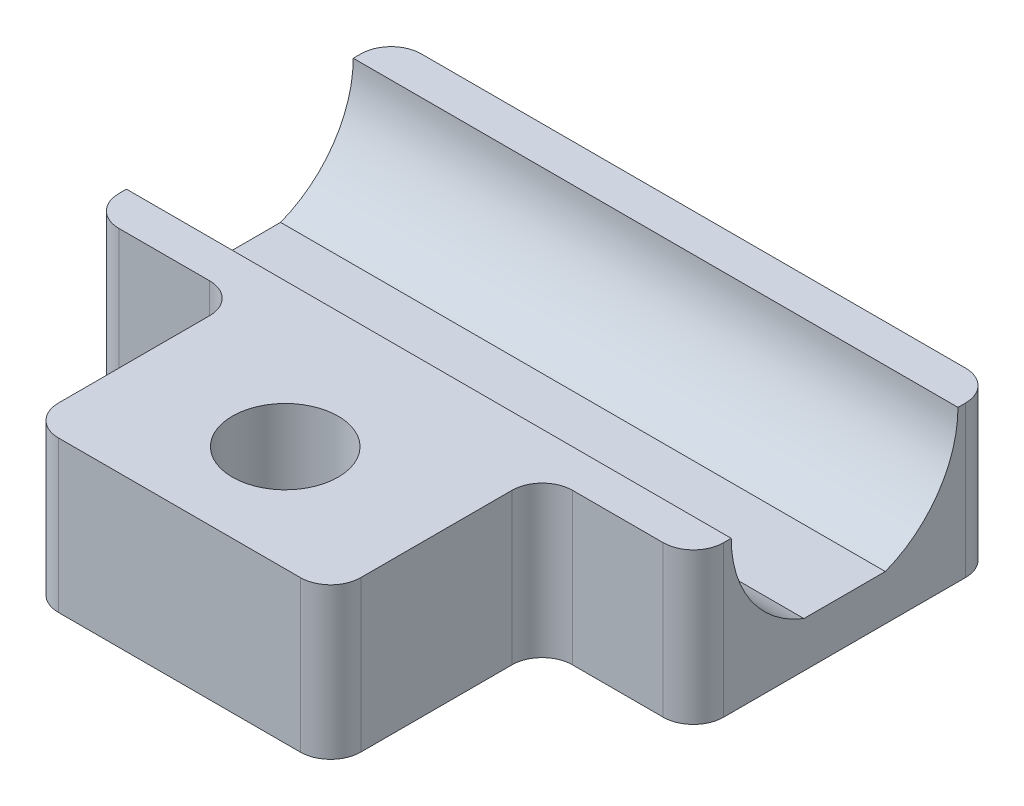
ISO-10303-21;
HEADER;
FILE_DESCRIPTION(('STEP AP214'),'2;1');
FILE_NAME('part.step','',(''),(''),'','','');
FILE_SCHEMA(('AUTOMOTIVE_DESIGN { 1 0 10303 214 1 1 1 1 }'));
ENDSEC;
DATA;
#1=APPLICATION_CONTEXT('core data for automotive mechanical design processes');
#2=APPLICATION_PROTOCOL_DEFINITION('international standard','automotive_design',2000,#1);
#3=PRODUCT_CONTEXT('',#1,'mechanical');
#4=PRODUCT('Part','Part','',(#3));
#5=PRODUCT_RELATED_PRODUCT_CATEGORY('part','',(#4));
#6=PRODUCT_DEFINITION_FORMATION('','',#4);
#7=PRODUCT_DEFINITION_CONTEXT('part definition',#1,'design');
#8=PRODUCT_DEFINITION('design','',#6,#7);
#9=PRODUCT_DEFINITION_SHAPE('','',#8);
#10=(LENGTH_UNIT() NAMED_UNIT(*) SI_UNIT(.MILLI.,.METRE.));
#11=(NAMED_UNIT(*) PLANE_ANGLE_UNIT() SI_UNIT($,.RADIAN.));
#12=(NAMED_UNIT(*) SI_UNIT($,.STERADIAN.) SOLID_ANGLE_UNIT());
#13=UNCERTAINTY_MEASURE_WITH_UNIT(LENGTH_MEASURE(1.E-05),#10,'distance_accuracy_value','');
#14=(GEOMETRIC_REPRESENTATION_CONTEXT(3) GLOBAL_UNCERTAINTY_ASSIGNED_CONTEXT((#13)) GLOBAL_UNIT_ASSIGNED_CONTEXT((#10,
#11,#12)) REPRESENTATION_CONTEXT('',''));
#15=CARTESIAN_POINT('',(0.,0.,0.));
#16=DIRECTION('',(0.,0.,1.));
#17=DIRECTION('',(1.,0.,0.));
#18=AXIS2_PLACEMENT_3D('',#15,#16,#17);
#19=CARTESIAN_POINT('',(0.,10.,0.));
#20=DIRECTION('',(0.,1.,0.));
#21=DIRECTION('',(0.,0.,1.));
#22=AXIS2_PLACEMENT_3D('',#19,#20,#21);
#23=PLANE('',#22);
#24=DIRECTION('',(0.,0.,1.));
#25=VECTOR('',#24,1.);
#26=CARTESIAN_POINT('',(-10.,10.,9.99999999999999));
#27=LINE('',#26,#25);
#28=CARTESIAN_POINT('',(-10.,10.,12.));
#29=VERTEX_POINT('',#28);
#30=CARTESIAN_POINT('',(-10.,10.,22.));
#31=VERTEX_POINT('',#30);
#32=EDGE_CURVE('E217',#29,#31,#27,.T.);
#33=ORIENTED_EDGE('',*,*,#32,.T.);
#34=CARTESIAN_POINT('',(-8.00000000000001,10.,22.));
#35=DIRECTION('',(0.,1.,0.));
#36=DIRECTION('',(0.,0.,1.));
#37=AXIS2_PLACEMENT_3D('',#34,#35,#36);
#38=CIRCLE('',#37,2.);
#39=CARTESIAN_POINT('',(-8.00000000000001,10.,24.));
#40=VERTEX_POINT('',#39);
#41=EDGE_CURVE('E287',#31,#40,#38,.T.);
#42=ORIENTED_EDGE('',*,*,#41,.T.);
#43=DIRECTION('',(1.,0.,0.));
#44=VECTOR('',#43,1.);
#45=CARTESIAN_POINT('',(-10.,10.,24.));
#46=LINE('',#45,#44);
#47=CARTESIAN_POINT('',(8.,10.,24.));
#48=VERTEX_POINT('',#47);
#49=EDGE_CURVE('E220',#40,#48,#46,.T.);
#50=ORIENTED_EDGE('',*,*,#49,.T.);
#51=CARTESIAN_POINT('',(7.99999999999999,10.,22.));
#52=DIRECTION('',(0.,1.,0.));
#53=DIRECTION('',(0.,0.,1.));
#54=AXIS2_PLACEMENT_3D('',#51,#52,#53);
#55=CIRCLE('',#54,2.);
#56=CARTESIAN_POINT('',(9.99999999999999,10.,22.));
#57=VERTEX_POINT('',#56);
#58=EDGE_CURVE('E281',#48,#57,#55,.T.);
#59=ORIENTED_EDGE('',*,*,#58,.T.);
#60=DIRECTION('',(0.,0.,-1.));
#61=VECTOR('',#60,1.);
#62=CARTESIAN_POINT('',(9.99999999999999,10.,9.99999999999999));
#63=LINE('',#62,#61);
#64=CARTESIAN_POINT('',(9.99999999999999,10.,12.));
#65=VERTEX_POINT('',#64);
#66=EDGE_CURVE('E223',#57,#65,#63,.T.);
#67=ORIENTED_EDGE('',*,*,#66,.T.);
#68=CARTESIAN_POINT('',(12.,10.,12.));
#69=DIRECTION('',(0.,1.,0.));
#70=DIRECTION('',(0.,0.,1.));
#71=AXIS2_PLACEMENT_3D('',#68,#69,#70);
#72=CIRCLE('',#71,2.);
#73=CARTESIAN_POINT('',(12.,10.,9.99999999999999));
#74=VERTEX_POINT('',#73);
#75=EDGE_CURVE('E11',#65,#74,#72,.F.);
#76=ORIENTED_EDGE('',*,*,#75,.T.);
#77=DIRECTION('',(1.,0.,0.));
#78=VECTOR('',#77,1.);
#79=CARTESIAN_POINT('',(20.,10.,10.));
#80=LINE('',#79,#78);
#81=CARTESIAN_POINT('',(18.,10.,10.));
#82=VERTEX_POINT('',#81);
#83=EDGE_CURVE('E226',#74,#82,#80,.T.);
#84=ORIENTED_EDGE('',*,*,#83,.T.);
#85=CARTESIAN_POINT('',(18.,10.,8.));
#86=DIRECTION('',(0.,1.,0.));
#87=DIRECTION('',(0.,0.,1.));
#88=AXIS2_PLACEMENT_3D('',#85,#86,#87);
#89=CIRCLE('',#88,2.);
#90=CARTESIAN_POINT('',(20.,10.,8.));
#91=VERTEX_POINT('',#90);
#92=EDGE_CURVE('E283',#82,#91,#89,.T.);
#93=ORIENTED_EDGE('',*,*,#92,.T.);
#94=DIRECTION('',(0.,0.,-1.));
#95=VECTOR('',#94,1.);
#96=CARTESIAN_POINT('',(20.,10.,10.));
#97=LINE('',#96,#95);
#98=CARTESIAN_POINT('',(20.,10.,7.5));
#99=VERTEX_POINT('',#98);
#100=EDGE_CURVE('E230',#91,#99,#97,.T.);
#101=ORIENTED_EDGE('',*,*,#100,.T.);
#102=DIRECTION('',(1.,0.,0.));
#103=VECTOR('',#102,1.);
#104=CARTESIAN_POINT('',(-20.,10.,7.49999999999999));
#105=LINE('',#104,#103);
#106=CARTESIAN_POINT('',(-20.,10.,7.49999999999999));
#107=VERTEX_POINT('',#106);
#108=EDGE_CURVE('E257',#107,#99,#105,.T.);
#109=ORIENTED_EDGE('',*,*,#108,.F.);
#110=DIRECTION('',(0.,0.,1.));
#111=VECTOR('',#110,1.);
#112=CARTESIAN_POINT('',(-20.,10.,10.));
#113=LINE('',#112,#111);
#114=CARTESIAN_POINT('',(-20.,10.,8.));
#115=VERTEX_POINT('',#114);
#116=EDGE_CURVE('E197',#107,#115,#113,.T.);
#117=ORIENTED_EDGE('',*,*,#116,.T.);
#118=CARTESIAN_POINT('',(-18.,10.,8.));
#119=DIRECTION('',(0.,1.,0.));
#120=DIRECTION('',(0.,0.,1.));
#121=AXIS2_PLACEMENT_3D('',#118,#119,#120);
#122=CIRCLE('',#121,2.);
#123=CARTESIAN_POINT('',(-18.,10.,10.));
#124=VERTEX_POINT('',#123);
#125=EDGE_CURVE('E285',#115,#124,#122,.T.);
#126=ORIENTED_EDGE('',*,*,#125,.T.);
#127=DIRECTION('',(1.,0.,0.));
#128=VECTOR('',#127,1.);
#129=CARTESIAN_POINT('',(-10.,10.,9.99999999999999));
#130=LINE('',#129,#128);
#131=CARTESIAN_POINT('',(-12.,10.,10.));
#132=VERTEX_POINT('',#131);
#133=EDGE_CURVE('E214',#124,#132,#130,.T.);
#134=ORIENTED_EDGE('',*,*,#133,.T.);
#135=CARTESIAN_POINT('',(-12.,10.,12.));
#136=DIRECTION('',(0.,1.,0.));
#137=DIRECTION('',(0.,0.,1.));
#138=AXIS2_PLACEMENT_3D('',#135,#136,#137);
#139=CIRCLE('',#138,2.);
#140=EDGE_CURVE('E323',#132,#29,#139,.F.);
#141=ORIENTED_EDGE('',*,*,#140,.T.);
#142=EDGE_LOOP('',(#33,#42,#50,#59,#67,#76,#84,#93,#101,#109,#117,#126,#134,#141));
#143=FACE_BOUND('',#142,.T.);
#144=CARTESIAN_POINT('',(0.,10.,17.));
#145=DIRECTION('',(0.,1.,0.));
#146=DIRECTION('',(0.,0.,1.));
#147=AXIS2_PLACEMENT_3D('',#144,#145,#146);
#148=CIRCLE('',#147,3.5);
#149=CARTESIAN_POINT('',(0.,10.,20.5));
#150=VERTEX_POINT('',#149);
#151=EDGE_CURVE('E204',#150,#150,#148,.T.);
#152=ORIENTED_EDGE('',*,*,#151,.F.);
#153=EDGE_LOOP('',(#152));
#154=FACE_BOUND('',#153,.T.);
#155=ADVANCED_FACE('F32',(#143,#154),#23,.T.);
#156=CARTESIAN_POINT('',(-20.,10.,10.));
#157=DIRECTION('',(1.,0.,0.));
#158=DIRECTION('',(0.,0.,-1.));
#159=AXIS2_PLACEMENT_3D('',#156,#157,#158);
#160=PLANE('',#159);
#161=DIRECTION('',(0.,0.,1.));
#162=VECTOR('',#161,1.);
#163=CARTESIAN_POINT('',(-20.,0.,10.));
#164=LINE('',#163,#162);
#165=CARTESIAN_POINT('',(-20.,0.,-7.99999999999999));
#166=VERTEX_POINT('',#165);
#167=CARTESIAN_POINT('',(-20.,0.,8.));
#168=VERTEX_POINT('',#167);
#169=EDGE_CURVE('E209',#166,#168,#164,.T.);
#170=ORIENTED_EDGE('',*,*,#169,.T.);
#171=DIRECTION('',(0.,-1.,0.));
#172=VECTOR('',#171,1.);
#173=CARTESIAN_POINT('',(-20.,10.,8.));
#174=LINE('',#173,#172);
#175=EDGE_CURVE('E297',#168,#115,#174,.F.);
#176=ORIENTED_EDGE('',*,*,#175,.T.);
#177=ORIENTED_EDGE('',*,*,#116,.F.);
#178=CARTESIAN_POINT('',(-20.,10.,0.));
#179=DIRECTION('',(1.,0.,0.));
#180=DIRECTION('',(0.,0.,-1.));
#181=AXIS2_PLACEMENT_3D('',#178,#179,#180);
#182=CIRCLE('',#181,7.5);
#183=CARTESIAN_POINT('',(-20.,3.,2.69258240356725));
#184=VERTEX_POINT('',#183);
#185=EDGE_CURVE('E176',#107,#184,#182,.T.);
#186=ORIENTED_EDGE('',*,*,#185,.T.);
#187=DIRECTION('',(0.,0.,-1.));
#188=VECTOR('',#187,1.);
#189=CARTESIAN_POINT('',(-20.,3.,2.69258240356725));
#190=LINE('',#189,#188);
#191=CARTESIAN_POINT('',(-20.,3.,-2.69258240356725));
#192=VERTEX_POINT('',#191);
#193=EDGE_CURVE('E184',#184,#192,#190,.T.);
#194=ORIENTED_EDGE('',*,*,#193,.T.);
#195=CARTESIAN_POINT('',(-20.,10.,-7.50000000000001));
#196=VERTEX_POINT('',#195);
#197=EDGE_CURVE('E191',#192,#196,#182,.T.);
#198=ORIENTED_EDGE('',*,*,#197,.T.);
#199=CARTESIAN_POINT('',(-20.,10.,-7.99999999999999));
#200=VERTEX_POINT('',#199);
#201=EDGE_CURVE('E212',#200,#196,#113,.T.);
#202=ORIENTED_EDGE('',*,*,#201,.F.);
#203=DIRECTION('',(0.,-1.,0.));
#204=VECTOR('',#203,1.);
#205=CARTESIAN_POINT('',(-20.,10.,-7.99999999999999));
#206=LINE('',#205,#204);
#207=EDGE_CURVE('E294',#200,#166,#206,.T.);
#208=ORIENTED_EDGE('',*,*,#207,.T.);
#209=EDGE_LOOP('',(#170,#176,#177,#186,#194,#198,#202,#208));
#210=FACE_BOUND('',#209,.T.);
#211=ADVANCED_FACE('F195',(#210),#160,.F.);
#212=CARTESIAN_POINT('',(-10.,10.,9.99999999999999));
#213=DIRECTION('',(0.,0.,-1.));
#214=DIRECTION('',(-1.,0.,0.));
#215=AXIS2_PLACEMENT_3D('',#212,#213,#214);
#216=PLANE('',#215);
#217=DIRECTION('',(1.,0.,0.));
#218=VECTOR('',#217,1.);
#219=CARTESIAN_POINT('',(-10.,0.,9.99999999999999));
#220=LINE('',#219,#218);
#221=CARTESIAN_POINT('',(-18.,0.,10.));
#222=VERTEX_POINT('',#221);
#223=CARTESIAN_POINT('',(-12.,0.,10.));
#224=VERTEX_POINT('',#223);
#225=EDGE_CURVE('E236',#222,#224,#220,.T.);
#226=ORIENTED_EDGE('',*,*,#225,.T.);
#227=DIRECTION('',(0.,-1.,0.));
#228=VECTOR('',#227,1.);
#229=CARTESIAN_POINT('',(-12.,10.,9.99999999999999));
#230=LINE('',#229,#228);
#231=EDGE_CURVE('E292',#224,#132,#230,.F.);
#232=ORIENTED_EDGE('',*,*,#231,.T.);
#233=ORIENTED_EDGE('',*,*,#133,.F.);
#234=DIRECTION('',(0.,-1.,0.));
#235=VECTOR('',#234,1.);
#236=CARTESIAN_POINT('',(-18.,10.,10.));
#237=LINE('',#236,#235);
#238=EDGE_CURVE('E289',#124,#222,#237,.T.);
#239=ORIENTED_EDGE('',*,*,#238,.T.);
#240=EDGE_LOOP('',(#226,#232,#233,#239));
#241=FACE_BOUND('',#240,.T.);
#242=ADVANCED_FACE('F383',(#241),#216,.F.);
#243=CARTESIAN_POINT('',(-10.,10.,9.99999999999999));
#244=DIRECTION('',(1.,0.,0.));
#245=DIRECTION('',(0.,0.,-1.));
#246=AXIS2_PLACEMENT_3D('',#243,#244,#245);
#247=PLANE('',#246);
#248=DIRECTION('',(0.,0.,1.));
#249=VECTOR('',#248,1.);
#250=CARTESIAN_POINT('',(-10.,0.,9.99999999999999));
#251=LINE('',#250,#249);
#252=CARTESIAN_POINT('',(-10.,0.,12.));
#253=VERTEX_POINT('',#252);
#254=CARTESIAN_POINT('',(-10.,0.,22.));
#255=VERTEX_POINT('',#254);
#256=EDGE_CURVE('E239',#253,#255,#251,.T.);
#257=ORIENTED_EDGE('',*,*,#256,.T.);
#258=DIRECTION('',(0.,-1.,0.));
#259=VECTOR('',#258,1.);
#260=CARTESIAN_POINT('',(-10.,10.,22.));
#261=LINE('',#260,#259);
#262=EDGE_CURVE('E279',#255,#31,#261,.F.);
#263=ORIENTED_EDGE('',*,*,#262,.T.);
#264=ORIENTED_EDGE('',*,*,#32,.F.);
#265=DIRECTION('',(0.,-1.,0.));
#266=VECTOR('',#265,1.);
#267=CARTESIAN_POINT('',(-10.,0.,12.));
#268=LINE('',#267,#266);
#269=EDGE_CURVE('E276',#29,#253,#268,.T.);
#270=ORIENTED_EDGE('',*,*,#269,.T.);
#271=EDGE_LOOP('',(#257,#263,#264,#270));
#272=FACE_BOUND('',#271,.T.);
#273=ADVANCED_FACE('F407',(#272),#247,.F.);
#274=CARTESIAN_POINT('',(-10.,10.,24.));
#275=DIRECTION('',(0.,0.,-1.));
#276=DIRECTION('',(-1.,0.,0.));
#277=AXIS2_PLACEMENT_3D('',#274,#275,#276);
#278=PLANE('',#277);
#279=ORIENTED_EDGE('',*,*,#49,.F.);
#280=DIRECTION('',(0.,-1.,0.));
#281=VECTOR('',#280,1.);
#282=CARTESIAN_POINT('',(-8.00000000000001,10.,24.));
#283=LINE('',#282,#281);
#284=CARTESIAN_POINT('',(-8.00000000000001,0.,24.));
#285=VERTEX_POINT('',#284);
#286=EDGE_CURVE('E261',#40,#285,#283,.T.);
#287=ORIENTED_EDGE('',*,*,#286,.T.);
#288=DIRECTION('',(1.,0.,0.));
#289=VECTOR('',#288,1.);
#290=CARTESIAN_POINT('',(-10.,0.,24.));
#291=LINE('',#290,#289);
#292=CARTESIAN_POINT('',(8.,0.,24.));
#293=VERTEX_POINT('',#292);
#294=EDGE_CURVE('E242',#285,#293,#291,.T.);
#295=ORIENTED_EDGE('',*,*,#294,.T.);
#296=DIRECTION('',(0.,-1.,0.));
#297=VECTOR('',#296,1.);
#298=CARTESIAN_POINT('',(8.,10.,24.));
#299=LINE('',#298,#297);
#300=EDGE_CURVE('E259',#293,#48,#299,.F.);
#301=ORIENTED_EDGE('',*,*,#300,.T.);
#302=EDGE_LOOP('',(#279,#287,#295,#301));
#303=FACE_BOUND('',#302,.T.);
#304=ADVANCED_FACE('F404',(#303),#278,.F.);
#305=CARTESIAN_POINT('',(9.99999999999999,10.,9.99999999999999));
#306=DIRECTION('',(-1.,0.,0.));
#307=DIRECTION('',(0.,0.,1.));
#308=AXIS2_PLACEMENT_3D('',#305,#306,#307);
#309=PLANE('',#308);
#310=DIRECTION('',(0.,0.,-1.));
#311=VECTOR('',#310,1.);
#312=CARTESIAN_POINT('',(9.99999999999999,0.,9.99999999999999));
#313=LINE('',#312,#311);
#314=CARTESIAN_POINT('',(9.99999999999999,0.,22.));
#315=VERTEX_POINT('',#314);
#316=CARTESIAN_POINT('',(9.99999999999999,0.,12.));
#317=VERTEX_POINT('',#316);
#318=EDGE_CURVE('E245',#315,#317,#313,.T.);
#319=ORIENTED_EDGE('',*,*,#318,.T.);
#320=DIRECTION('',(0.,-1.,0.));
#321=VECTOR('',#320,1.);
#322=CARTESIAN_POINT('',(9.99999999999999,10.,12.));
#323=LINE('',#322,#321);
#324=EDGE_CURVE('E319',#317,#65,#323,.F.);
#325=ORIENTED_EDGE('',*,*,#324,.T.);
#326=ORIENTED_EDGE('',*,*,#66,.F.);
#327=DIRECTION('',(0.,-1.,0.));
#328=VECTOR('',#327,1.);
#329=CARTESIAN_POINT('',(9.99999999999999,10.,22.));
#330=LINE('',#329,#328);
#331=EDGE_CURVE('E316',#57,#315,#330,.T.);
#332=ORIENTED_EDGE('',*,*,#331,.T.);
#333=EDGE_LOOP('',(#319,#325,#326,#332));
#334=FACE_BOUND('',#333,.T.);
#335=ADVANCED_FACE('F333',(#334),#309,.F.);
#336=CARTESIAN_POINT('',(20.,10.,10.));
#337=DIRECTION('',(0.,0.,-1.));
#338=DIRECTION('',(-1.,0.,0.));
#339=AXIS2_PLACEMENT_3D('',#336,#337,#338);
#340=PLANE('',#339);
#341=DIRECTION('',(1.,0.,0.));
#342=VECTOR('',#341,1.);
#343=CARTESIAN_POINT('',(20.,0.,10.));
#344=LINE('',#343,#342);
#345=CARTESIAN_POINT('',(12.,0.,9.99999999999999));
#346=VERTEX_POINT('',#345);
#347=CARTESIAN_POINT('',(18.,0.,10.));
#348=VERTEX_POINT('',#347);
#349=EDGE_CURVE('E248',#346,#348,#344,.T.);
#350=ORIENTED_EDGE('',*,*,#349,.T.);
#351=DIRECTION('',(0.,-1.,0.));
#352=VECTOR('',#351,1.);
#353=CARTESIAN_POINT('',(18.,10.,10.));
#354=LINE('',#353,#352);
#355=EDGE_CURVE('E314',#348,#82,#354,.F.);
#356=ORIENTED_EDGE('',*,*,#355,.T.);
#357=ORIENTED_EDGE('',*,*,#83,.F.);
#358=DIRECTION('',(0.,-1.,0.));
#359=VECTOR('',#358,1.);
#360=CARTESIAN_POINT('',(12.,0.,9.99999999999999));
#361=LINE('',#360,#359);
#362=EDGE_CURVE('E311',#74,#346,#361,.T.);
#363=ORIENTED_EDGE('',*,*,#362,.T.);
#364=EDGE_LOOP('',(#350,#356,#357,#363));
#365=FACE_BOUND('',#364,.T.);
#366=ADVANCED_FACE('F343',(#365),#340,.F.);
#367=CARTESIAN_POINT('',(20.,10.,10.));
#368=DIRECTION('',(-1.,0.,0.));
#369=DIRECTION('',(0.,0.,1.));
#370=AXIS2_PLACEMENT_3D('',#367,#368,#369);
#371=PLANE('',#370);
#372=DIRECTION('',(0.,0.,-1.));
#373=VECTOR('',#372,1.);
#374=CARTESIAN_POINT('',(20.,0.,10.));
#375=LINE('',#374,#373);
#376=CARTESIAN_POINT('',(20.,0.,8.));
#377=VERTEX_POINT('',#376);
#378=CARTESIAN_POINT('',(20.,0.,-8.));
#379=VERTEX_POINT('',#378);
#380=EDGE_CURVE('E251',#377,#379,#375,.T.);
#381=ORIENTED_EDGE('',*,*,#380,.T.);
#382=DIRECTION('',(0.,-1.,0.));
#383=VECTOR('',#382,1.);
#384=CARTESIAN_POINT('',(20.,10.,-8.));
#385=LINE('',#384,#383);
#386=CARTESIAN_POINT('',(20.,10.,-8.));
#387=VERTEX_POINT('',#386);
#388=EDGE_CURVE('E47',#379,#387,#385,.F.);
#389=ORIENTED_EDGE('',*,*,#388,.T.);
#390=CARTESIAN_POINT('',(20.,10.,-7.5));
#391=VERTEX_POINT('',#390);
#392=EDGE_CURVE('E229',#391,#387,#97,.T.);
#393=ORIENTED_EDGE('',*,*,#392,.F.);
#394=CARTESIAN_POINT('',(20.,10.,0.));
#395=DIRECTION('',(1.,0.,0.));
#396=DIRECTION('',(0.,0.,-1.));
#397=AXIS2_PLACEMENT_3D('',#394,#395,#396);
#398=CIRCLE('',#397,7.5);
#399=CARTESIAN_POINT('',(20.,3.,-2.69258240356725));
#400=VERTEX_POINT('',#399);
#401=EDGE_CURVE('E200',#400,#391,#398,.T.);
#402=ORIENTED_EDGE('',*,*,#401,.F.);
#403=DIRECTION('',(0.,0.,-1.));
#404=VECTOR('',#403,1.);
#405=CARTESIAN_POINT('',(20.,3.,2.69258240356725));
#406=LINE('',#405,#404);
#407=CARTESIAN_POINT('',(20.,3.,2.69258240356725));
#408=VERTEX_POINT('',#407);
#409=EDGE_CURVE('E198',#408,#400,#406,.T.);
#410=ORIENTED_EDGE('',*,*,#409,.F.);
#411=EDGE_CURVE('E179',#99,#408,#398,.T.);
#412=ORIENTED_EDGE('',*,*,#411,.F.);
#413=ORIENTED_EDGE('',*,*,#100,.F.);
#414=DIRECTION('',(0.,-1.,0.));
#415=VECTOR('',#414,1.);
#416=CARTESIAN_POINT('',(20.,10.,8.));
#417=LINE('',#416,#415);
#418=EDGE_CURVE('E307',#91,#377,#417,.T.);
#419=ORIENTED_EDGE('',*,*,#418,.T.);
#420=EDGE_LOOP('',(#381,#389,#393,#402,#410,#412,#413,#419));
#421=FACE_BOUND('',#420,.T.);
#422=ADVANCED_FACE('F349',(#421),#371,.F.);
#423=CARTESIAN_POINT('',(20.,10.,-10.));
#424=DIRECTION('',(0.,0.,1.));
#425=DIRECTION('',(1.,0.,0.));
#426=AXIS2_PLACEMENT_3D('',#423,#424,#425);
#427=PLANE('',#426);
#428=DIRECTION('',(-1.,0.,0.));
#429=VECTOR('',#428,1.);
#430=CARTESIAN_POINT('',(20.,0.,-10.));
#431=LINE('',#430,#429);
#432=CARTESIAN_POINT('',(18.,0.,-10.));
#433=VERTEX_POINT('',#432);
#434=CARTESIAN_POINT('',(-18.,0.,-9.99999999999999));
#435=VERTEX_POINT('',#434);
#436=EDGE_CURVE('E253',#433,#435,#431,.T.);
#437=ORIENTED_EDGE('',*,*,#436,.T.);
#438=DIRECTION('',(0.,-1.,0.));
#439=VECTOR('',#438,1.);
#440=CARTESIAN_POINT('',(-18.,10.,-9.99999999999999));
#441=LINE('',#440,#439);
#442=CARTESIAN_POINT('',(-18.,10.,-9.99999999999999));
#443=VERTEX_POINT('',#442);
#444=EDGE_CURVE('E55',#435,#443,#441,.F.);
#445=ORIENTED_EDGE('',*,*,#444,.T.);
#446=DIRECTION('',(-1.,0.,0.));
#447=VECTOR('',#446,1.);
#448=CARTESIAN_POINT('',(20.,10.,-10.));
#449=LINE('',#448,#447);
#450=CARTESIAN_POINT('',(18.,10.,-10.));
#451=VERTEX_POINT('',#450);
#452=EDGE_CURVE('E232',#451,#443,#449,.T.);
#453=ORIENTED_EDGE('',*,*,#452,.F.);
#454=DIRECTION('',(0.,-1.,0.));
#455=VECTOR('',#454,1.);
#456=CARTESIAN_POINT('',(18.,10.,-10.));
#457=LINE('',#456,#455);
#458=EDGE_CURVE('E299',#451,#433,#457,.T.);
#459=ORIENTED_EDGE('',*,*,#458,.T.);
#460=EDGE_LOOP('',(#437,#445,#453,#459));
#461=FACE_BOUND('',#460,.T.);
#462=ADVANCED_FACE('F365',(#461),#427,.F.);
#463=ORIENTED_EDGE('',*,*,#452,.T.);
#464=CARTESIAN_POINT('',(-18.,10.,-7.99999999999999));
#465=DIRECTION('',(0.,1.,0.));
#466=DIRECTION('',(0.,0.,1.));
#467=AXIS2_PLACEMENT_3D('',#464,#465,#466);
#468=CIRCLE('',#467,2.);
#469=EDGE_CURVE('E305',#443,#200,#468,.T.);
#470=ORIENTED_EDGE('',*,*,#469,.T.);
#471=ORIENTED_EDGE('',*,*,#201,.T.);
#472=DIRECTION('',(1.,0.,0.));
#473=VECTOR('',#472,1.);
#474=CARTESIAN_POINT('',(-20.,10.,-7.50000000000001));
#475=LINE('',#474,#473);
#476=EDGE_CURVE('E234',#391,#196,#475,.F.);
#477=ORIENTED_EDGE('',*,*,#476,.F.);
#478=ORIENTED_EDGE('',*,*,#392,.T.);
#479=CARTESIAN_POINT('',(18.,10.,-8.));
#480=DIRECTION('',(0.,1.,0.));
#481=DIRECTION('',(0.,0.,1.));
#482=AXIS2_PLACEMENT_3D('',#479,#480,#481);
#483=CIRCLE('',#482,2.);
#484=EDGE_CURVE('E303',#387,#451,#483,.T.);
#485=ORIENTED_EDGE('',*,*,#484,.T.);
#486=EDGE_LOOP('',(#463,#470,#471,#477,#478,#485));
#487=FACE_BOUND('',#486,.T.);
#488=ADVANCED_FACE('F356',(#487),#23,.T.);
#489=CARTESIAN_POINT('',(0.,0.,0.));
#490=DIRECTION('',(0.,1.,0.));
#491=DIRECTION('',(0.,0.,1.));
#492=AXIS2_PLACEMENT_3D('',#489,#490,#491);
#493=PLANE('',#492);
#494=CARTESIAN_POINT('',(0.,0.,17.));
#495=DIRECTION('',(0.,1.,0.));
#496=DIRECTION('',(0.,0.,1.));
#497=AXIS2_PLACEMENT_3D('',#494,#495,#496);
#498=CIRCLE('',#497,3.5);
#499=CARTESIAN_POINT('',(0.,0.,20.5));
#500=VERTEX_POINT('',#499);
#501=EDGE_CURVE('E206',#500,#500,#498,.T.);
#502=ORIENTED_EDGE('',*,*,#501,.T.);
#503=EDGE_LOOP('',(#502));
#504=FACE_BOUND('',#503,.T.);
#505=ORIENTED_EDGE('',*,*,#294,.F.);
#506=CARTESIAN_POINT('',(-8.00000000000001,0.,22.));
#507=DIRECTION('',(0.,1.,0.));
#508=DIRECTION('',(0.,0.,1.));
#509=AXIS2_PLACEMENT_3D('',#506,#507,#508);
#510=CIRCLE('',#509,2.);
#511=EDGE_CURVE('E274',#285,#255,#510,.F.);
#512=ORIENTED_EDGE('',*,*,#511,.T.);
#513=ORIENTED_EDGE('',*,*,#256,.F.);
#514=CARTESIAN_POINT('',(-12.,0.,12.));
#515=DIRECTION('',(0.,1.,0.));
#516=DIRECTION('',(0.,0.,1.));
#517=AXIS2_PLACEMENT_3D('',#514,#515,#516);
#518=CIRCLE('',#517,2.);
#519=EDGE_CURVE('E321',#253,#224,#518,.T.);
#520=ORIENTED_EDGE('',*,*,#519,.T.);
#521=ORIENTED_EDGE('',*,*,#225,.F.);
#522=CARTESIAN_POINT('',(-18.,0.,8.));
#523=DIRECTION('',(0.,1.,0.));
#524=DIRECTION('',(0.,0.,1.));
#525=AXIS2_PLACEMENT_3D('',#522,#523,#524);
#526=CIRCLE('',#525,2.);
#527=EDGE_CURVE('E272',#222,#168,#526,.F.);
#528=ORIENTED_EDGE('',*,*,#527,.T.);
#529=ORIENTED_EDGE('',*,*,#169,.F.);
#530=CARTESIAN_POINT('',(-18.,0.,-7.99999999999999));
#531=DIRECTION('',(0.,1.,0.));
#532=DIRECTION('',(0.,0.,1.));
#533=AXIS2_PLACEMENT_3D('',#530,#531,#532);
#534=CIRCLE('',#533,2.);
#535=EDGE_CURVE('E270',#166,#435,#534,.F.);
#536=ORIENTED_EDGE('',*,*,#535,.T.);
#537=ORIENTED_EDGE('',*,*,#436,.F.);
#538=CARTESIAN_POINT('',(18.,0.,-8.));
#539=DIRECTION('',(0.,1.,0.));
#540=DIRECTION('',(0.,0.,1.));
#541=AXIS2_PLACEMENT_3D('',#538,#539,#540);
#542=CIRCLE('',#541,2.);
#543=EDGE_CURVE('E268',#433,#379,#542,.F.);
#544=ORIENTED_EDGE('',*,*,#543,.T.);
#545=ORIENTED_EDGE('',*,*,#380,.F.);
#546=CARTESIAN_POINT('',(18.,0.,8.));
#547=DIRECTION('',(0.,1.,0.));
#548=DIRECTION('',(0.,0.,1.));
#549=AXIS2_PLACEMENT_3D('',#546,#547,#548);
#550=CIRCLE('',#549,2.);
#551=EDGE_CURVE('E266',#377,#348,#550,.F.);
#552=ORIENTED_EDGE('',*,*,#551,.T.);
#553=ORIENTED_EDGE('',*,*,#349,.F.);
#554=CARTESIAN_POINT('',(12.,0.,12.));
#555=DIRECTION('',(0.,1.,0.));
#556=DIRECTION('',(0.,0.,1.));
#557=AXIS2_PLACEMENT_3D('',#554,#555,#556);
#558=CIRCLE('',#557,2.);
#559=EDGE_CURVE('E40',#346,#317,#558,.T.);
#560=ORIENTED_EDGE('',*,*,#559,.T.);
#561=ORIENTED_EDGE('',*,*,#318,.F.);
#562=CARTESIAN_POINT('',(7.99999999999999,0.,22.));
#563=DIRECTION('',(0.,1.,0.));
#564=DIRECTION('',(0.,0.,1.));
#565=AXIS2_PLACEMENT_3D('',#562,#563,#564);
#566=CIRCLE('',#565,2.);
#567=EDGE_CURVE('E264',#315,#293,#566,.F.);
#568=ORIENTED_EDGE('',*,*,#567,.T.);
#569=EDGE_LOOP('',(#505,#512,#513,#520,#521,#528,#529,#536,#537,#544,#545,#552,#553,#560,#561,#568));
#570=FACE_BOUND('',#569,.T.);
#571=ADVANCED_FACE('F328',(#504,#570),#493,.F.);
#572=CARTESIAN_POINT('',(0.,0.,17.));
#573=DIRECTION('',(0.,1.,0.));
#574=DIRECTION('',(0.,0.,1.));
#575=AXIS2_PLACEMENT_3D('',#572,#573,#574);
#576=CYLINDRICAL_SURFACE('',#575,3.5);
#577=ORIENTED_EDGE('',*,*,#501,.F.);
#578=EDGE_LOOP('',(#577));
#579=FACE_BOUND('',#578,.T.);
#580=ORIENTED_EDGE('',*,*,#151,.T.);
#581=EDGE_LOOP('',(#580));
#582=FACE_BOUND('',#581,.T.);
#583=ADVANCED_FACE('F392',(#579,#582),#576,.F.);
#584=CARTESIAN_POINT('',(-20.,10.,0.));
#585=DIRECTION('',(1.,0.,0.));
#586=DIRECTION('',(0.,0.,-1.));
#587=AXIS2_PLACEMENT_3D('',#584,#585,#586);
#588=CYLINDRICAL_SURFACE('',#587,7.5);
#589=ORIENTED_EDGE('',*,*,#108,.T.);
#590=ORIENTED_EDGE('',*,*,#411,.T.);
#591=DIRECTION('',(1.,0.,0.));
#592=VECTOR('',#591,1.);
#593=CARTESIAN_POINT('',(-20.,3.,2.69258240356725));
#594=LINE('',#593,#592);
#595=EDGE_CURVE('E171',#184,#408,#594,.T.);
#596=ORIENTED_EDGE('',*,*,#595,.F.);
#597=ORIENTED_EDGE('',*,*,#185,.F.);
#598=EDGE_LOOP('',(#589,#590,#596,#597));
#599=FACE_BOUND('',#598,.T.);
#600=ADVANCED_FACE('F174',(#599),#588,.F.);
#601=ORIENTED_EDGE('',*,*,#476,.T.);
#602=ORIENTED_EDGE('',*,*,#197,.F.);
#603=DIRECTION('',(1.,0.,0.));
#604=VECTOR('',#603,1.);
#605=CARTESIAN_POINT('',(-20.,3.,-2.69258240356725));
#606=LINE('',#605,#604);
#607=EDGE_CURVE('E183',#192,#400,#606,.T.);
#608=ORIENTED_EDGE('',*,*,#607,.T.);
#609=ORIENTED_EDGE('',*,*,#401,.T.);
#610=EDGE_LOOP('',(#601,#602,#608,#609));
#611=FACE_BOUND('',#610,.T.);
#612=ADVANCED_FACE('F354',(#611),#588,.F.);
#613=CARTESIAN_POINT('',(-20.,3.,2.69258240356725));
#614=DIRECTION('',(0.,-1.,0.));
#615=DIRECTION('',(0.,0.,-1.));
#616=AXIS2_PLACEMENT_3D('',#613,#614,#615);
#617=PLANE('',#616);
#618=ORIENTED_EDGE('',*,*,#409,.T.);
#619=ORIENTED_EDGE('',*,*,#607,.F.);
#620=ORIENTED_EDGE('',*,*,#193,.F.);
#621=ORIENTED_EDGE('',*,*,#595,.T.);
#622=EDGE_LOOP('',(#618,#619,#620,#621));
#623=FACE_BOUND('',#622,.T.);
#624=ADVANCED_FACE('F187',(#623),#617,.F.);
#625=CARTESIAN_POINT('',(-8.00000000000001,10.,22.));
#626=DIRECTION('',(0.,-1.,0.));
#627=DIRECTION('',(0.,0.,-1.));
#628=AXIS2_PLACEMENT_3D('',#625,#626,#627);
#629=CYLINDRICAL_SURFACE('',#628,2.);
#630=ORIENTED_EDGE('',*,*,#41,.F.);
#631=ORIENTED_EDGE('',*,*,#262,.F.);
#632=ORIENTED_EDGE('',*,*,#511,.F.);
#633=ORIENTED_EDGE('',*,*,#286,.F.);
#634=EDGE_LOOP('',(#630,#631,#632,#633));
#635=FACE_BOUND('',#634,.T.);
#636=ADVANCED_FACE('F415',(#635),#629,.T.);
#637=CARTESIAN_POINT('',(-12.,10.,12.));
#638=DIRECTION('',(0.,1.,0.));
#639=DIRECTION('',(0.,0.,1.));
#640=AXIS2_PLACEMENT_3D('',#637,#638,#639);
#641=CYLINDRICAL_SURFACE('',#640,2.);
#642=ORIENTED_EDGE('',*,*,#140,.F.);
#643=ORIENTED_EDGE('',*,*,#231,.F.);
#644=ORIENTED_EDGE('',*,*,#519,.F.);
#645=ORIENTED_EDGE('',*,*,#269,.F.);
#646=EDGE_LOOP('',(#642,#643,#644,#645));
#647=FACE_BOUND('',#646,.T.);
#648=ADVANCED_FACE('F418',(#647),#641,.F.);
#649=CARTESIAN_POINT('',(-18.,10.,8.));
#650=DIRECTION('',(0.,-1.,0.));
#651=DIRECTION('',(0.,0.,-1.));
#652=AXIS2_PLACEMENT_3D('',#649,#650,#651);
#653=CYLINDRICAL_SURFACE('',#652,2.);
#654=ORIENTED_EDGE('',*,*,#125,.F.);
#655=ORIENTED_EDGE('',*,*,#175,.F.);
#656=ORIENTED_EDGE('',*,*,#527,.F.);
#657=ORIENTED_EDGE('',*,*,#238,.F.);
#658=EDGE_LOOP('',(#654,#655,#656,#657));
#659=FACE_BOUND('',#658,.T.);
#660=ADVANCED_FACE('F376',(#659),#653,.T.);
#661=CARTESIAN_POINT('',(-18.,10.,-7.99999999999999));
#662=DIRECTION('',(0.,-1.,0.));
#663=DIRECTION('',(0.,0.,-1.));
#664=AXIS2_PLACEMENT_3D('',#661,#662,#663);
#665=CYLINDRICAL_SURFACE('',#664,2.);
#666=ORIENTED_EDGE('',*,*,#469,.F.);
#667=ORIENTED_EDGE('',*,*,#444,.F.);
#668=ORIENTED_EDGE('',*,*,#535,.F.);
#669=ORIENTED_EDGE('',*,*,#207,.F.);
#670=EDGE_LOOP('',(#666,#667,#668,#669));
#671=FACE_BOUND('',#670,.T.);
#672=ADVANCED_FACE('F363',(#671),#665,.T.);
#673=CARTESIAN_POINT('',(18.,10.,-8.));
#674=DIRECTION('',(0.,-1.,0.));
#675=DIRECTION('',(0.,0.,-1.));
#676=AXIS2_PLACEMENT_3D('',#673,#674,#675);
#677=CYLINDRICAL_SURFACE('',#676,2.);
#678=ORIENTED_EDGE('',*,*,#484,.F.);
#679=ORIENTED_EDGE('',*,*,#388,.F.);
#680=ORIENTED_EDGE('',*,*,#543,.F.);
#681=ORIENTED_EDGE('',*,*,#458,.F.);
#682=EDGE_LOOP('',(#678,#679,#680,#681));
#683=FACE_BOUND('',#682,.T.);
#684=ADVANCED_FACE('F368',(#683),#677,.T.);
#685=CARTESIAN_POINT('',(18.,10.,8.));
#686=DIRECTION('',(0.,-1.,0.));
#687=DIRECTION('',(0.,0.,-1.));
#688=AXIS2_PLACEMENT_3D('',#685,#686,#687);
#689=CYLINDRICAL_SURFACE('',#688,2.);
#690=ORIENTED_EDGE('',*,*,#92,.F.);
#691=ORIENTED_EDGE('',*,*,#355,.F.);
#692=ORIENTED_EDGE('',*,*,#551,.F.);
#693=ORIENTED_EDGE('',*,*,#418,.F.);
#694=EDGE_LOOP('',(#690,#691,#692,#693));
#695=FACE_BOUND('',#694,.T.);
#696=ADVANCED_FACE('F346',(#695),#689,.T.);
#697=CARTESIAN_POINT('',(12.,10.,12.));
#698=DIRECTION('',(0.,1.,0.));
#699=DIRECTION('',(0.,0.,1.));
#700=AXIS2_PLACEMENT_3D('',#697,#698,#699);
#701=CYLINDRICAL_SURFACE('',#700,2.);
#702=ORIENTED_EDGE('',*,*,#75,.F.);
#703=ORIENTED_EDGE('',*,*,#324,.F.);
#704=ORIENTED_EDGE('',*,*,#559,.F.);
#705=ORIENTED_EDGE('',*,*,#362,.F.);
#706=EDGE_LOOP('',(#702,#703,#704,#705));
#707=FACE_BOUND('',#706,.T.);
#708=ADVANCED_FACE('F337',(#707),#701,.F.);
#709=CARTESIAN_POINT('',(7.99999999999999,10.,22.));
#710=DIRECTION('',(0.,-1.,0.));
#711=DIRECTION('',(0.,0.,-1.));
#712=AXIS2_PLACEMENT_3D('',#709,#710,#711);
#713=CYLINDRICAL_SURFACE('',#712,2.);
#714=ORIENTED_EDGE('',*,*,#58,.F.);
#715=ORIENTED_EDGE('',*,*,#300,.F.);
#716=ORIENTED_EDGE('',*,*,#567,.F.);
#717=ORIENTED_EDGE('',*,*,#331,.F.);
#718=EDGE_LOOP('',(#714,#715,#716,#717));
#719=FACE_BOUND('',#718,.T.);
#720=ADVANCED_FACE('F34',(#719),#713,.T.);
#721=CLOSED_SHELL('',(#155,#211,#242,#273,#304,#335,#366,#422,#462,#488,#571,#583,#600,#612,
#624,#636,#648,#660,#672,#684,#696,#708,#720));
#722=MANIFOLD_SOLID_BREP('B2',#721);
#723=ADVANCED_BREP_SHAPE_REPRESENTATION('',(#18,#722),#14);
#724=SHAPE_DEFINITION_REPRESENTATION(#9,#723);
ENDSEC;
END-ISO-10303-21;
